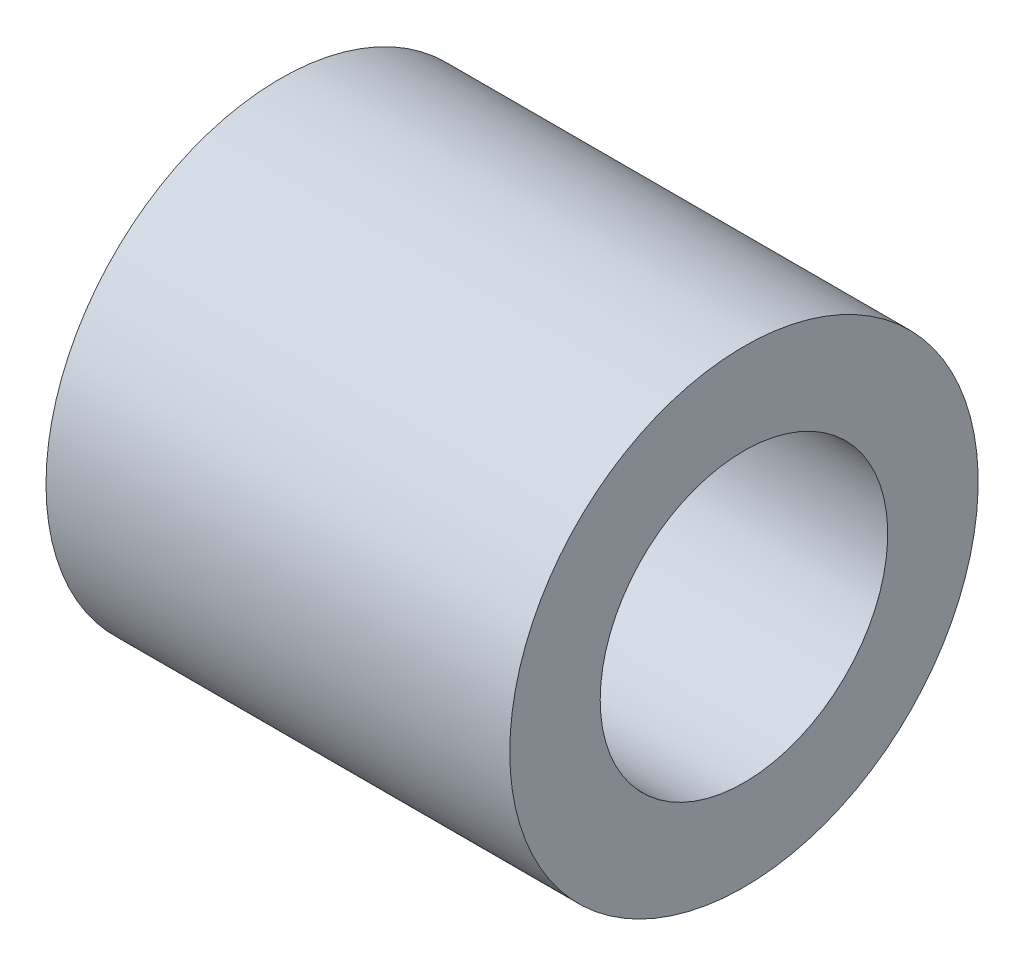
ISO-10303-21;
HEADER;
FILE_DESCRIPTION(('STEP AP214'),'2;1');
FILE_NAME('part.step','',(''),(''),'','','');
FILE_SCHEMA(('AUTOMOTIVE_DESIGN { 1 0 10303 214 1 1 1 1 }'));
ENDSEC;
DATA;
#1=APPLICATION_CONTEXT('core data for automotive mechanical design processes');
#2=APPLICATION_PROTOCOL_DEFINITION('international standard','automotive_design',2000,#1);
#3=PRODUCT_CONTEXT('',#1,'mechanical');
#4=PRODUCT('Part','Part','',(#3));
#5=PRODUCT_RELATED_PRODUCT_CATEGORY('part','',(#4));
#6=PRODUCT_DEFINITION_FORMATION('','',#4);
#7=PRODUCT_DEFINITION_CONTEXT('part definition',#1,'design');
#8=PRODUCT_DEFINITION('design','',#6,#7);
#9=PRODUCT_DEFINITION_SHAPE('','',#8);
#10=(LENGTH_UNIT() NAMED_UNIT(*) SI_UNIT(.MILLI.,.METRE.));
#11=(NAMED_UNIT(*) PLANE_ANGLE_UNIT() SI_UNIT($,.RADIAN.));
#12=(NAMED_UNIT(*) SI_UNIT($,.STERADIAN.) SOLID_ANGLE_UNIT());
#13=UNCERTAINTY_MEASURE_WITH_UNIT(LENGTH_MEASURE(1.E-05),#10,'distance_accuracy_value','');
#14=(GEOMETRIC_REPRESENTATION_CONTEXT(3) GLOBAL_UNCERTAINTY_ASSIGNED_CONTEXT((#13)) GLOBAL_UNIT_ASSIGNED_CONTEXT((#10,
#11,#12)) REPRESENTATION_CONTEXT('',''));
#15=CARTESIAN_POINT('',(0.,0.,0.));
#16=DIRECTION('',(0.,0.,1.));
#17=DIRECTION('',(1.,0.,0.));
#18=AXIS2_PLACEMENT_3D('',#15,#16,#17);
#19=CARTESIAN_POINT('',(0.,3.937,0.));
#20=DIRECTION('',(1.,0.,0.));
#21=DIRECTION('',(0.,0.,-1.));
#22=AXIS2_PLACEMENT_3D('',#19,#20,#21);
#23=PLANE('',#22);
#24=CARTESIAN_POINT('',(0.,0.,0.));
#25=DIRECTION('',(-1.,0.,0.));
#26=DIRECTION('',(0.,0.,1.));
#27=AXIS2_PLACEMENT_3D('',#24,#25,#26);
#28=CIRCLE('',#27,3.937);
#29=CARTESIAN_POINT('',(0.,0.,3.937));
#30=VERTEX_POINT('',#29);
#31=EDGE_CURVE('E54',#30,#30,#28,.T.);
#32=ORIENTED_EDGE('',*,*,#31,.F.);
#33=EDGE_LOOP('',(#32));
#34=FACE_BOUND('',#33,.T.);
#35=CARTESIAN_POINT('',(0.,0.,0.));
#36=DIRECTION('',(-1.,0.,0.));
#37=DIRECTION('',(0.,0.,1.));
#38=AXIS2_PLACEMENT_3D('',#35,#36,#37);
#39=CIRCLE('',#38,6.4135);
#40=CARTESIAN_POINT('',(0.,0.,6.4135));
#41=VERTEX_POINT('',#40);
#42=EDGE_CURVE('E10',#41,#41,#39,.T.);
#43=ORIENTED_EDGE('',*,*,#42,.T.);
#44=EDGE_LOOP('',(#43));
#45=FACE_BOUND('',#44,.T.);
#46=ADVANCED_FACE('F37',(#34,#45),#23,.F.);
#47=CARTESIAN_POINT('',(0.,0.,0.));
#48=DIRECTION('',(-1.,0.,0.));
#49=DIRECTION('',(0.,0.,1.));
#50=AXIS2_PLACEMENT_3D('',#47,#48,#49);
#51=CYLINDRICAL_SURFACE('',#50,6.4135);
#52=ORIENTED_EDGE('',*,*,#42,.F.);
#53=EDGE_LOOP('',(#52));
#54=FACE_BOUND('',#53,.T.);
#55=CARTESIAN_POINT('',(12.7,0.,0.));
#56=DIRECTION('',(-1.,0.,0.));
#57=DIRECTION('',(0.,0.,1.));
#58=AXIS2_PLACEMENT_3D('',#55,#56,#57);
#59=CIRCLE('',#58,6.4135);
#60=CARTESIAN_POINT('',(12.7,0.,6.4135));
#61=VERTEX_POINT('',#60);
#62=EDGE_CURVE('E44',#61,#61,#59,.T.);
#63=ORIENTED_EDGE('',*,*,#62,.T.);
#64=EDGE_LOOP('',(#63));
#65=FACE_BOUND('',#64,.T.);
#66=ADVANCED_FACE('F64',(#54,#65),#51,.T.);
#67=CARTESIAN_POINT('',(12.7,3.937,0.));
#68=DIRECTION('',(-1.,0.,0.));
#69=DIRECTION('',(0.,0.,1.));
#70=AXIS2_PLACEMENT_3D('',#67,#68,#69);
#71=PLANE('',#70);
#72=ORIENTED_EDGE('',*,*,#62,.F.);
#73=EDGE_LOOP('',(#72));
#74=FACE_BOUND('',#73,.T.);
#75=CARTESIAN_POINT('',(12.7,0.,0.));
#76=DIRECTION('',(-1.,0.,0.));
#77=DIRECTION('',(0.,0.,1.));
#78=AXIS2_PLACEMENT_3D('',#75,#76,#77);
#79=CIRCLE('',#78,3.937);
#80=CARTESIAN_POINT('',(12.7,0.,3.937));
#81=VERTEX_POINT('',#80);
#82=EDGE_CURVE('E49',#81,#81,#79,.T.);
#83=ORIENTED_EDGE('',*,*,#82,.T.);
#84=EDGE_LOOP('',(#83));
#85=FACE_BOUND('',#84,.T.);
#86=ADVANCED_FACE('F68',(#74,#85),#71,.F.);
#87=CARTESIAN_POINT('',(0.,0.,0.));
#88=DIRECTION('',(-1.,0.,0.));
#89=DIRECTION('',(0.,0.,1.));
#90=AXIS2_PLACEMENT_3D('',#87,#88,#89);
#91=CYLINDRICAL_SURFACE('',#90,3.937);
#92=ORIENTED_EDGE('',*,*,#82,.F.);
#93=EDGE_LOOP('',(#92));
#94=FACE_BOUND('',#93,.T.);
#95=ORIENTED_EDGE('',*,*,#31,.T.);
#96=EDGE_LOOP('',(#95));
#97=FACE_BOUND('',#96,.T.);
#98=ADVANCED_FACE('F61',(#94,#97),#91,.F.);
#99=CLOSED_SHELL('',(#46,#66,#86,#98));
#100=MANIFOLD_SOLID_BREP('B2',#99);
#101=ADVANCED_BREP_SHAPE_REPRESENTATION('',(#18,#100),#14);
#102=SHAPE_DEFINITION_REPRESENTATION(#9,#101);
ENDSEC;
END-ISO-10303-21;
